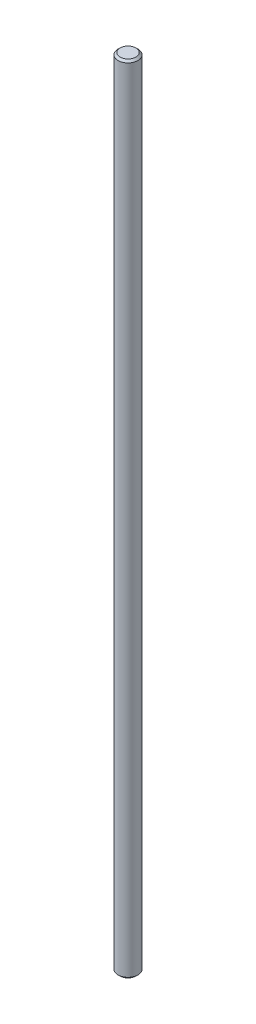
ISO-10303-21;
HEADER;
FILE_DESCRIPTION(('STEP AP214'),'2;1');
FILE_NAME('part.step','',(''),(''),'','','');
FILE_SCHEMA(('AUTOMOTIVE_DESIGN { 1 0 10303 214 1 1 1 1 }'));
ENDSEC;
DATA;
#1=APPLICATION_CONTEXT('core data for automotive mechanical design processes');
#2=APPLICATION_PROTOCOL_DEFINITION('international standard','automotive_design',2000,#1);
#3=PRODUCT_CONTEXT('',#1,'mechanical');
#4=PRODUCT('Part','Part','',(#3));
#5=PRODUCT_RELATED_PRODUCT_CATEGORY('part','',(#4));
#6=PRODUCT_DEFINITION_FORMATION('','',#4);
#7=PRODUCT_DEFINITION_CONTEXT('part definition',#1,'design');
#8=PRODUCT_DEFINITION('design','',#6,#7);
#9=PRODUCT_DEFINITION_SHAPE('','',#8);
#10=(LENGTH_UNIT() NAMED_UNIT(*) SI_UNIT(.MILLI.,.METRE.));
#11=(NAMED_UNIT(*) PLANE_ANGLE_UNIT() SI_UNIT($,.RADIAN.));
#12=(NAMED_UNIT(*) SI_UNIT($,.STERADIAN.) SOLID_ANGLE_UNIT());
#13=UNCERTAINTY_MEASURE_WITH_UNIT(LENGTH_MEASURE(1.E-05),#10,'distance_accuracy_value','');
#14=(GEOMETRIC_REPRESENTATION_CONTEXT(3) GLOBAL_UNCERTAINTY_ASSIGNED_CONTEXT((#13)) GLOBAL_UNIT_ASSIGNED_CONTEXT((#10,
#11,#12)) REPRESENTATION_CONTEXT('',''));
#15=CARTESIAN_POINT('',(0.,0.,0.));
#16=DIRECTION('',(0.,0.,1.));
#17=DIRECTION('',(1.,0.,0.));
#18=AXIS2_PLACEMENT_3D('',#15,#16,#17);
#19=CARTESIAN_POINT('',(0.,320.,0.));
#20=DIRECTION('',(0.,-1.,0.));
#21=DIRECTION('',(0.,0.,-1.));
#22=AXIS2_PLACEMENT_3D('',#19,#20,#21);
#23=CYLINDRICAL_SURFACE('',#22,4.);
#24=CARTESIAN_POINT('',(0.,0.799999999999967,0.));
#25=DIRECTION('',(0.,1.,0.));
#26=DIRECTION('',(0.,0.,1.));
#27=AXIS2_PLACEMENT_3D('',#24,#25,#26);
#28=CIRCLE('',#27,4.);
#29=CARTESIAN_POINT('',(0.,0.799999999999967,4.));
#30=VERTEX_POINT('',#29);
#31=EDGE_CURVE('E44',#30,#30,#28,.T.);
#32=ORIENTED_EDGE('',*,*,#31,.T.);
#33=EDGE_LOOP('',(#32));
#34=FACE_BOUND('',#33,.T.);
#35=CARTESIAN_POINT('',(0.,319.2,0.));
#36=DIRECTION('',(0.,1.,0.));
#37=DIRECTION('',(0.,0.,1.));
#38=AXIS2_PLACEMENT_3D('',#35,#36,#37);
#39=CIRCLE('',#38,4.);
#40=CARTESIAN_POINT('',(0.,319.2,4.));
#41=VERTEX_POINT('',#40);
#42=EDGE_CURVE('E48',#41,#41,#39,.F.);
#43=ORIENTED_EDGE('',*,*,#42,.T.);
#44=EDGE_LOOP('',(#43));
#45=FACE_BOUND('',#44,.T.);
#46=ADVANCED_FACE('F33',(#34,#45),#23,.T.);
#47=CARTESIAN_POINT('',(0.,320.,0.));
#48=DIRECTION('',(0.,1.,0.));
#49=DIRECTION('',(0.,0.,1.));
#50=AXIS2_PLACEMENT_3D('',#47,#48,#49);
#51=PLANE('',#50);
#52=CARTESIAN_POINT('',(0.,320.,0.));
#53=DIRECTION('',(0.,1.,0.));
#54=DIRECTION('',(0.,0.,1.));
#55=AXIS2_PLACEMENT_3D('',#52,#53,#54);
#56=CIRCLE('',#55,3.19999999999995);
#57=CARTESIAN_POINT('',(0.,320.,3.19999999999995));
#58=VERTEX_POINT('',#57);
#59=EDGE_CURVE('E10',#58,#58,#56,.T.);
#60=ORIENTED_EDGE('',*,*,#59,.T.);
#61=EDGE_LOOP('',(#60));
#62=FACE_BOUND('',#61,.T.);
#63=ADVANCED_FACE('F64',(#62),#51,.T.);
#64=CARTESIAN_POINT('',(0.,0.,0.));
#65=DIRECTION('',(0.,1.,0.));
#66=DIRECTION('',(0.,0.,1.));
#67=AXIS2_PLACEMENT_3D('',#64,#65,#66);
#68=PLANE('',#67);
#69=CARTESIAN_POINT('',(0.,0.,0.));
#70=DIRECTION('',(0.,1.,0.));
#71=DIRECTION('',(0.,0.,1.));
#72=AXIS2_PLACEMENT_3D('',#69,#70,#71);
#73=CIRCLE('',#72,3.20000000000001);
#74=CARTESIAN_POINT('',(0.,0.,3.20000000000001));
#75=VERTEX_POINT('',#74);
#76=EDGE_CURVE('E40',#75,#75,#73,.F.);
#77=ORIENTED_EDGE('',*,*,#76,.T.);
#78=EDGE_LOOP('',(#77));
#79=FACE_BOUND('',#78,.T.);
#80=ADVANCED_FACE('F61',(#79),#68,.F.);
#81=CARTESIAN_POINT('',(0.,0.799999999999967,0.));
#82=DIRECTION('',(0.,1.,0.));
#83=DIRECTION('',(0.,0.,1.));
#84=AXIS2_PLACEMENT_3D('',#81,#82,#83);
#85=CONICAL_SURFACE('',#84,4.,0.785398163397463);
#86=ORIENTED_EDGE('',*,*,#76,.F.);
#87=EDGE_LOOP('',(#86));
#88=FACE_BOUND('',#87,.T.);
#89=ORIENTED_EDGE('',*,*,#31,.F.);
#90=EDGE_LOOP('',(#89));
#91=FACE_BOUND('',#90,.T.);
#92=ADVANCED_FACE('F57',(#88,#91),#85,.T.);
#93=CARTESIAN_POINT('',(0.,320.,0.));
#94=DIRECTION('',(0.,-1.,0.));
#95=DIRECTION('',(0.,0.,-1.));
#96=AXIS2_PLACEMENT_3D('',#93,#94,#95);
#97=CONICAL_SURFACE('',#96,3.19999999999995,0.785398163397463);
#98=ORIENTED_EDGE('',*,*,#42,.F.);
#99=EDGE_LOOP('',(#98));
#100=FACE_BOUND('',#99,.T.);
#101=ORIENTED_EDGE('',*,*,#59,.F.);
#102=EDGE_LOOP('',(#101));
#103=FACE_BOUND('',#102,.T.);
#104=ADVANCED_FACE('F35',(#100,#103),#97,.T.);
#105=CLOSED_SHELL('',(#46,#63,#80,#92,#104));
#106=MANIFOLD_SOLID_BREP('B2',#105);
#107=ADVANCED_BREP_SHAPE_REPRESENTATION('',(#18,#106),#14);
#108=SHAPE_DEFINITION_REPRESENTATION(#9,#107);
ENDSEC;
END-ISO-10303-21;
